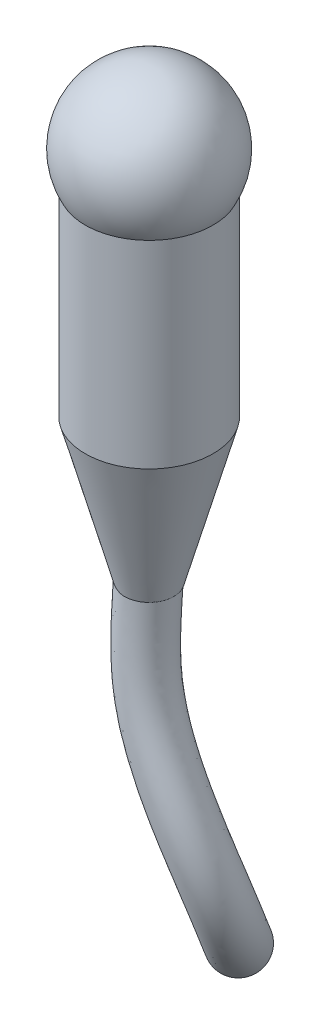
ISO-10303-21;
HEADER;
FILE_DESCRIPTION(('STEP AP214'),'2;1');
FILE_NAME('part.step','',(''),(''),'','','');
FILE_SCHEMA(('AUTOMOTIVE_DESIGN { 1 0 10303 214 1 1 1 1 }'));
ENDSEC;
DATA;
#1=APPLICATION_CONTEXT('core data for automotive mechanical design processes');
#2=APPLICATION_PROTOCOL_DEFINITION('international standard','automotive_design',2000,#1);
#3=PRODUCT_CONTEXT('',#1,'mechanical');
#4=PRODUCT('Part','Part','',(#3));
#5=PRODUCT_RELATED_PRODUCT_CATEGORY('part','',(#4));
#6=PRODUCT_DEFINITION_FORMATION('','',#4);
#7=PRODUCT_DEFINITION_CONTEXT('part definition',#1,'design');
#8=PRODUCT_DEFINITION('design','',#6,#7);
#9=PRODUCT_DEFINITION_SHAPE('','',#8);
#10=(LENGTH_UNIT() NAMED_UNIT(*) SI_UNIT(.MILLI.,.METRE.));
#11=(NAMED_UNIT(*) PLANE_ANGLE_UNIT() SI_UNIT($,.RADIAN.));
#12=(NAMED_UNIT(*) SI_UNIT($,.STERADIAN.) SOLID_ANGLE_UNIT());
#13=UNCERTAINTY_MEASURE_WITH_UNIT(LENGTH_MEASURE(1.E-05),#10,'distance_accuracy_value','');
#14=(GEOMETRIC_REPRESENTATION_CONTEXT(3) GLOBAL_UNCERTAINTY_ASSIGNED_CONTEXT((#13)) GLOBAL_UNIT_ASSIGNED_CONTEXT((#10,
#11,#12)) REPRESENTATION_CONTEXT('',''));
#15=CARTESIAN_POINT('',(0.,0.,0.));
#16=DIRECTION('',(0.,0.,1.));
#17=DIRECTION('',(1.,0.,0.));
#18=AXIS2_PLACEMENT_3D('',#15,#16,#17);
#19=CARTESIAN_POINT('',(0.,58.3812793036266,0.));
#20=DIRECTION('',(0.,-1.,0.));
#21=DIRECTION('',(-1.,0.,0.));
#22=AXIS2_PLACEMENT_3D('',#19,#20,#21);
#23=SPHERICAL_SURFACE('',#22,8.8);
#24=CARTESIAN_POINT('',(0.,54.2126464342076,0.));
#25=DIRECTION('',(0.,-1.,0.));
#26=DIRECTION('',(0.,0.,-1.));
#27=AXIS2_PLACEMENT_3D('',#24,#25,#26);
#28=CIRCLE('',#27,7.75);
#29=CARTESIAN_POINT('',(0.,54.2126464342076,-7.75));
#30=VERTEX_POINT('',#29);
#31=EDGE_CURVE('E76',#30,#30,#28,.T.);
#32=ORIENTED_EDGE('',*,*,#31,.F.);
#33=EDGE_LOOP('',(#32));
#34=FACE_BOUND('',#33,.T.);
#35=ADVANCED_FACE('F44',(#34),#23,.T.);
#36=CARTESIAN_POINT('',(-3.,12.850690899188,0.));
#37=DIRECTION('',(0.,1.,0.));
#38=DIRECTION('',(0.,0.,1.));
#39=AXIS2_PLACEMENT_3D('',#36,#37,#38);
#40=PLANE('',#39);
#41=CARTESIAN_POINT('',(0.,12.850690899188,0.));
#42=DIRECTION('',(0.,-1.,0.));
#43=DIRECTION('',(0.,0.,-1.));
#44=AXIS2_PLACEMENT_3D('',#41,#42,#43);
#45=CIRCLE('',#44,3.);
#46=CARTESIAN_POINT('',(0.134007092648553,12.850690899188,-2.99700552203694));
#47=VERTEX_POINT('',#46);
#48=CARTESIAN_POINT('',(-0.235301468746703,12.850690899188,2.99075796727279));
#49=VERTEX_POINT('',#48);
#50=EDGE_CURVE('E58',#47,#49,#45,.T.);
#51=ORIENTED_EDGE('',*,*,#50,.T.);
#52=CARTESIAN_POINT('',(-3.036,12.850690899188,0.757914247006341));
#53=CARTESIAN_POINT('',(-3.01453534718988,12.850690899188,0.839432556032653));
#54=CARTESIAN_POINT('',(-2.98961696251307,12.850690899188,0.92003717946122));
#55=CARTESIAN_POINT('',(-2.93308457112739,12.850690899188,1.07885900927999));
#56=CARTESIAN_POINT('',(-2.90147088579331,12.850690899188,1.15707633005475));
#57=CARTESIAN_POINT('',(-2.83178273683319,12.850690899188,1.31051616840775));
#58=CARTESIAN_POINT('',(-2.79371294244399,12.850690899188,1.38574080217837));
#59=CARTESIAN_POINT('',(-2.71139129984447,12.850690899188,1.53269982213694));
#60=CARTESIAN_POINT('',(-2.66713952762622,12.8506908991879,1.60443425121367));
#61=CARTESIAN_POINT('',(-2.52550302672171,12.8506908991879,1.81369800813955));
#62=CARTESIAN_POINT('',(-2.4192074994784,12.8506908991879,1.94535285670011));
#63=CARTESIAN_POINT('',(-2.18610207290923,12.850690899188,2.18885223563337));
#64=CARTESIAN_POINT('',(-2.05929614040584,12.850690899188,2.30070058794373));
#65=CARTESIAN_POINT('',(-1.7886702834515,12.850690899188,2.50158165055279));
#66=CARTESIAN_POINT('',(-1.64484629126984,12.850690899188,2.59060888988285));
#67=CARTESIAN_POINT('',(-1.3442850407071,12.8506908991879,2.74328538824266));
#68=CARTESIAN_POINT('',(-1.18754577584281,12.8506908991879,2.80693069499791));
#69=CARTESIAN_POINT('',(-0.865484441373721,12.8506908991879,2.90708326020741));
#70=CARTESIAN_POINT('',(-0.700155545991635,12.8506908991879,2.94356857180375));
#71=CARTESIAN_POINT('',(-0.365731527276455,12.850690899188,2.98829454598316));
#72=CARTESIAN_POINT('',(-0.196636619009383,12.850690899188,2.99653681730244));
#73=CARTESIAN_POINT('',(0.140725975646862,12.850690899188,2.98455510471622));
#74=CARTESIAN_POINT('',(0.308992562665089,12.850690899188,2.96430015911136));
#75=CARTESIAN_POINT('',(0.639747510129853,12.850690899188,2.89585109278276));
#76=CARTESIAN_POINT('',(0.802235720098235,12.850690899188,2.84765624502404));
#77=CARTESIAN_POINT('',(1.11695099781968,12.850690899188,2.72464810380082));
#78=CARTESIAN_POINT('',(1.2691699140783,12.850690899188,2.64981395372119));
#79=CARTESIAN_POINT('',(1.55888582954204,12.8506908991879,2.47565658731833));
#80=CARTESIAN_POINT('',(1.69638289035114,12.8506908991879,2.37633347347556));
#81=CARTESIAN_POINT('',(1.95276795616635,12.8506908991879,2.15599590803043));
#82=CARTESIAN_POINT('',(2.07165331317792,12.8506908991879,2.03497837508237));
#83=CARTESIAN_POINT('',(2.28740585196054,12.850690899188,1.77469146690402));
#84=CARTESIAN_POINT('',(2.38427304917174,12.850690899188,1.63542210447286));
#85=CARTESIAN_POINT('',(2.55317377824998,12.850690899188,1.34266891734483));
#86=CARTESIAN_POINT('',(2.62522172628744,12.850690899188,1.18919341018961));
#87=CARTESIAN_POINT('',(2.74249893369506,12.8506908991879,0.872316445531289));
#88=CARTESIAN_POINT('',(2.78772834425911,12.850690899188,0.708915043992769));
#89=CARTESIAN_POINT('',(2.85003472653281,12.850690899188,0.377003306307281));
#90=CARTESIAN_POINT('',(2.86714045642855,12.850690899188,0.20849836868621));
#91=CARTESIAN_POINT('',(2.87278950080723,12.8506908991879,-0.128989647688534));
#92=CARTESIAN_POINT('',(2.8613329803371,12.8506908991879,-0.297972723673649));
#93=CARTESIAN_POINT('',(2.81019978666376,12.8506908991879,-0.631442879368711));
#94=CARTESIAN_POINT('',(2.77055096867521,12.8506908991879,-0.795934230647587));
#95=CARTESIAN_POINT('',(2.66418576995046,12.850690899188,-1.11591932010876));
#96=CARTESIAN_POINT('',(2.59746948019102,12.850690899188,-1.27141308853092));
#97=CARTESIAN_POINT('',(2.43890647381336,12.8506908991879,-1.56890805264043));
#98=CARTESIAN_POINT('',(2.3470726096946,12.8506908991879,-1.71091609895345));
#99=CARTESIAN_POINT('',(2.14087093927895,12.850690899188,-1.97750155192417));
#100=CARTESIAN_POINT('',(2.02650317083045,12.850690899188,-2.10207898785809));
#101=CARTESIAN_POINT('',(1.77846488204402,12.850690899188,-2.33029437079982));
#102=CARTESIAN_POINT('',(1.64479120996408,12.850690899188,-2.43392889217846));
#103=CARTESIAN_POINT('',(1.36195232957652,12.850690899188,-2.6173051155245));
#104=CARTESIAN_POINT('',(1.21278697086643,12.850690899188,-2.69704658549483));
#105=CARTESIAN_POINT('',(0.903081269744321,12.850690899188,-2.83043940823771));
#106=CARTESIAN_POINT('',(0.742532455423861,12.850690899188,-2.88407109080216));
#107=CARTESIAN_POINT('',(0.414718090569481,12.8506908991879,-2.96364760463196));
#108=CARTESIAN_POINT('',(0.247452658693228,12.8506908991879,-2.98959292478934));
#109=CARTESIAN_POINT('',(-0.0892228520942838,12.8506908991879,-3.01308829888523));
#110=CARTESIAN_POINT('',(-0.258634843567239,12.8506908991879,-3.01061094691752));
#111=CARTESIAN_POINT('',(-0.594655617387066,12.850690899188,-2.97727357618437));
#112=CARTESIAN_POINT('',(-0.761264180402845,12.850690899188,-2.94641134709587));
#113=CARTESIAN_POINT('',(-1.08708833802037,12.850690899188,-2.85714419190242));
#114=CARTESIAN_POINT('',(-1.24629730941014,12.850690899188,-2.79871509368898));
#115=CARTESIAN_POINT('',(-1.55262288851786,12.8506908991879,-2.65597195859868));
#116=CARTESIAN_POINT('',(-1.69974180461163,12.850690899188,-2.57166287765793));
#117=CARTESIAN_POINT('',(-1.97776576162378,12.850690899188,-2.37954695908453));
#118=CARTESIAN_POINT('',(-2.10866700892144,12.850690899188,-2.27173463981282));
#119=CARTESIAN_POINT('',(-2.35059038358897,12.850690899188,-2.03554501829538));
#120=CARTESIAN_POINT('',(-2.46160553316535,12.850690899188,-1.90716052734089));
#121=CARTESIAN_POINT('',(-2.61554847362196,12.850690899188,-1.69543944854089));
#122=CARTESIAN_POINT('',(-2.66661097089121,12.850690899188,-1.61788234172115));
#123=CARTESIAN_POINT('',(-2.7613630046263,12.850690899188,-1.45834771841428));
#124=CARTESIAN_POINT('',(-2.80505168850483,12.850690899188,-1.37636969220823));
#125=CARTESIAN_POINT('',(-2.8847140360585,12.850690899188,-1.20857783182771));
#126=CARTESIAN_POINT('',(-2.92067408188656,12.850690899188,-1.1227575438214));
#127=CARTESIAN_POINT('',(-2.98448893212176,12.850690899188,-0.948156325264998));
#128=CARTESIAN_POINT('',(-3.01234385014103,12.850690899188,-0.859375436234033));
#129=CARTESIAN_POINT('',(-3.036,12.850690899188,-0.769483811605983));
#130=B_SPLINE_CURVE_WITH_KNOTS('',3,(#52,#53,#54,#55,#56,#57,#58,#59,#60,#61,#62,#63,#64,#65,
#66,#67,#68,#69,#70,#71,#72,#73,#74,#75,#76,#77,#78,#79,#80,#81,#82,#83,#84,#85,#86,#87,#88,#89,
#90,#91,#92,#93,#94,#95,#96,#97,#98,#99,#100,#101,#102,#103,#104,#105,#106,#107,#108,#109,#110,
#111,#112,#113,#114,#115,#116,#117,#118,#119,#120,#121,#122,#123,#124,#125,#126,#127,#128,#129),
.UNSPECIFIED.,.F.,.F.,(4,2,2,2,2,2,2,2,2,2,2,2,2,2,2,2,2,2,2,2,2,2,2,2,2,2,2,2,2,2,2,2,2,2,2,2,
2,2,4),(0.,0.25280848319997,0.505604834328379,0.758219129813679,1.01083032030711,
1.5158409785478,2.02075408154983,2.5257881158042,3.03090075930202,3.53642112148992,
4.04191268853312,4.54795388713157,5.05400825421426,5.56045969922222,6.0669090248878,
6.57343034066547,7.07995130124556,7.58617755291974,8.09240095063366,8.59810638123382,
9.10380888962262,9.60901243502334,10.114214282393,10.6191581033328,11.1241010761658,
11.629126575707,12.1341569787929,12.6395672677487,13.144968631908,13.6508573586025,
14.1567854820573,14.6631580572481,15.1694337240967,15.6758275957296,16.1823988083211,
16.4606313829957,16.7388961059341,17.0176471825854,17.2963943517063),.UNSPECIFIED.);
#131=EDGE_CURVE('E64',#49,#47,#130,.T.);
#132=ORIENTED_EDGE('',*,*,#131,.T.);
#133=EDGE_LOOP('',(#51,#132));
#134=FACE_BOUND('',#133,.T.);
#135=ADVANCED_FACE('F84',(#134),#40,.F.);
#136=CARTESIAN_POINT('',(0.,30.2126464342076,0.));
#137=DIRECTION('',(0.,1.,0.));
#138=DIRECTION('',(0.,0.,1.));
#139=AXIS2_PLACEMENT_3D('',#136,#137,#138);
#140=CONICAL_SURFACE('',#139,7.75,0.26705179651545);
#141=ORIENTED_EDGE('',*,*,#50,.F.);
#142=CARTESIAN_POINT('',(0.134007092648553,12.850690899188,-2.99700552203694));
#143=CARTESIAN_POINT('',(0.0504732445235257,12.8650414260412,-3.00467808502679));
#144=CARTESIAN_POINT('',(-0.0334168859771233,12.8792075697684,-3.00878701410247));
#145=CARTESIAN_POINT('',(-0.201318186460793,12.9070859097784,-3.00986795061194));
#146=CARTESIAN_POINT('',(-0.285329356149125,12.9207981071645,-3.00683997539232));
#147=CARTESIAN_POINT('',(-0.452846962408835,12.9476778825016,-2.99364021789881));
#148=CARTESIAN_POINT('',(-0.536353593414968,12.9608456834209,-2.98347139161793));
#149=CARTESIAN_POINT('',(-0.702268422927768,12.9865673513041,-2.95606366777852));
#150=CARTESIAN_POINT('',(-0.784676648666372,12.9991212335091,-2.93882494583649));
#151=CARTESIAN_POINT('',(-1.02948454435506,13.0357844685673,-2.87659712183902));
#152=CARTESIAN_POINT('',(-1.18949994972385,13.0589006051102,-2.82109378442348));
#153=CARTESIAN_POINT('',(-1.49801311835965,13.102022576208,-2.68361084008733));
#154=CARTESIAN_POINT('',(-1.64651450770096,13.1220293919821,-2.60163961096439));
#155=CARTESIAN_POINT('',(-1.92678814250346,13.1585692918199,-2.41415680841438));
#156=CARTESIAN_POINT('',(-2.05867163215412,13.1751260206303,-2.30881642456509));
#157=CARTESIAN_POINT('',(-2.30306967697562,13.2047808516614,-2.07721805331418));
#158=CARTESIAN_POINT('',(-2.41558131257698,13.2178784327058,-1.950956918523));
#159=CARTESIAN_POINT('',(-2.6174524331312,13.2404719528858,-1.68175822351326));
#160=CARTESIAN_POINT('',(-2.70691728438974,13.2499843787423,-1.538901053097));
#161=CARTESIAN_POINT('',(-2.86078406833737,13.2654608281464,-1.24011090482582));
#162=CARTESIAN_POINT('',(-2.92518804886262,13.2714251416471,-1.08417899663255));
#163=CARTESIAN_POINT('',(-3.02702025561417,13.2798114703823,-0.763896865499365));
#164=CARTESIAN_POINT('',(-3.06448644251455,13.2822384753603,-0.599558839881379));
#165=CARTESIAN_POINT('',(-3.11153430590277,13.2836116752968,-0.266921250596871));
#166=CARTESIAN_POINT('',(-3.12111524657972,13.282557778406,-0.0986215825122033));
#167=CARTESIAN_POINT('',(-3.11213942947094,13.2770425747445,0.237301036946384));
#168=CARTESIAN_POINT('',(-3.09356049809369,13.2725785841777,0.404923350725608));
#169=CARTESIAN_POINT('',(-3.02879091310779,13.2603448767374,0.734617642292637));
#170=CARTESIAN_POINT('',(-2.98260030642824,13.2525751654823,0.896689629513343));
#171=CARTESIAN_POINT('',(-2.86382705722849,13.2338426843069,1.21108661986789));
#172=CARTESIAN_POINT('',(-2.79118384205635,13.2228725975458,1.36338830135575));
#173=CARTESIAN_POINT('',(-2.62163789246755,13.1979140351236,1.65355284759677));
#174=CARTESIAN_POINT('',(-2.5247351280477,13.1839255557293,1.7914156944923));
#175=CARTESIAN_POINT('',(-2.30911801860235,13.1530844354816,2.04927409435888));
#176=CARTESIAN_POINT('',(-2.19033384891586,13.1362226390205,2.16921015738519));
#177=CARTESIAN_POINT('',(-1.93455879323563,13.0999111489654,2.3873540111847));
#178=CARTESIAN_POINT('',(-1.79756453556012,13.0804609761209,2.48555776912646));
#179=CARTESIAN_POINT('',(-1.50870368647774,13.0391877353418,2.65787231264559));
#180=CARTESIAN_POINT('',(-1.35677480239401,13.0173546827051,2.73187608844136));
#181=CARTESIAN_POINT('',(-1.04294068568469,12.9717507574273,2.85311902463623));
#182=CARTESIAN_POINT('',(-0.881044999120187,12.9479817321944,2.90038336672194));
#183=CARTESIAN_POINT('',(-0.637195947856197,12.9116489997525,2.94972917458205));
#184=CARTESIAN_POINT('',(-0.557194762622323,12.8996467829354,2.96253655077227));
#185=CARTESIAN_POINT('',(-0.396608453069378,12.8753681683666,2.98157027143321));
#186=CARTESIAN_POINT('',(-0.316024689237605,12.863092321242,2.98780879443762));
#187=CARTESIAN_POINT('',(-0.235301468746705,12.8506908991879,2.99075796727279));
#188=B_SPLINE_CURVE_WITH_KNOTS('',3,(#142,#143,#144,#145,#146,#147,#148,#149,#150,#151,#152,
#153,#154,#155,#156,#157,#158,#159,#160,#161,#162,#163,#164,#165,#166,#167,#168,#169,#170,#171,
#172,#173,#174,#175,#176,#177,#178,#179,#180,#181,#182,#183,#184,#185,#186,#187),.UNSPECIFIED.,
.F.,.F.,(4,2,2,2,2,2,2,2,2,2,2,2,2,2,2,2,2,2,2,2,2,2,4),(0.,0.25523241543905,0.510464210523982,
0.765590413293623,1.02071027910159,1.53085217623545,2.04083275780601,2.54719410884305,
3.05363170790204,3.55771112827773,4.06174934940895,4.56507588147605,5.06841569475241,
5.57215205283718,6.07588755476854,6.58078386726606,7.08568080420112,7.59221771606664,
8.09884854655644,8.60769026950331,9.1160519929831,9.36153593965005,9.60656395787482),.UNSPECIFIED.);
#189=EDGE_CURVE('E12',#47,#49,#188,.T.);
#190=ORIENTED_EDGE('',*,*,#189,.T.);
#191=EDGE_LOOP('',(#141,#190));
#192=FACE_BOUND('',#191,.T.);
#193=CARTESIAN_POINT('',(0.,30.2126464342076,0.));
#194=DIRECTION('',(0.,-1.,0.));
#195=DIRECTION('',(0.,0.,-1.));
#196=AXIS2_PLACEMENT_3D('',#193,#194,#195);
#197=CIRCLE('',#196,7.75);
#198=CARTESIAN_POINT('',(0.,30.2126464342076,-7.75));
#199=VERTEX_POINT('',#198);
#200=EDGE_CURVE('E123',#199,#199,#197,.T.);
#201=ORIENTED_EDGE('',*,*,#200,.T.);
#202=EDGE_LOOP('',(#201));
#203=FACE_BOUND('',#202,.T.);
#204=ADVANCED_FACE('F102',(#192,#203),#140,.T.);
#205=CARTESIAN_POINT('',(0.,0.,0.));
#206=DIRECTION('',(0.,-1.,0.));
#207=DIRECTION('',(0.,0.,-1.));
#208=AXIS2_PLACEMENT_3D('',#205,#206,#207);
#209=CYLINDRICAL_SURFACE('',#208,7.75);
#210=ORIENTED_EDGE('',*,*,#200,.F.);
#211=EDGE_LOOP('',(#210));
#212=FACE_BOUND('',#211,.T.);
#213=ORIENTED_EDGE('',*,*,#31,.T.);
#214=EDGE_LOOP('',(#213));
#215=FACE_BOUND('',#214,.T.);
#216=ADVANCED_FACE('F92',(#212,#215),#209,.T.);
#217=CARTESIAN_POINT('',(4.75715060304388,-27.6266682423645,-3.75744441062145));
#218=CARTESIAN_POINT('',(5.69857095394223,-26.2294212982871,-2.62390904831083));
#219=CARTESIAN_POINT('',(6.4748833375661,-24.6600468204225,-1.55104711329615));
#220=CARTESIAN_POINT('',(7.13216349588797,-21.9353834345446,-0.094616901820176));
#221=CARTESIAN_POINT('',(7.25702648909662,-20.9950521641348,0.348345854613561));
#222=CARTESIAN_POINT('',(7.31060804803402,-19.0649192388516,1.14299003003289));
#223=CARTESIAN_POINT('',(7.23726862742879,-18.0710757835996,1.4951352458388));
#224=CARTESIAN_POINT('',(6.77210846285164,-15.1351265468329,2.39014467795099));
#225=CARTESIAN_POINT('',(6.15235133764831,-13.2471542875376,2.7786182373638));
#226=CARTESIAN_POINT('',(4.7082414448164,-9.57181006985666,3.3105061919895));
#227=CARTESIAN_POINT('',(3.88666169104428,-7.78927104903873,3.45272077274813));
#228=CARTESIAN_POINT('',(2.71860362154967,-5.12571326770846,3.55954199986895));
#229=CARTESIAN_POINT('',(2.33817088184822,-4.23723879724996,3.57703437826453));
#230=CARTESIAN_POINT('',(1.62673447508452,-2.45125968809336,3.58342439221357));
#231=CARTESIAN_POINT('',(1.29594131755953,-1.55396264802341,3.57235434516711));
#232=CARTESIAN_POINT('',(0.42173227790827,1.17053199695927,3.50758936910492));
#233=CARTESIAN_POINT('',(0.0281714785636681,3.03508551263123,3.42076146183023));
#234=CARTESIAN_POINT('',(-0.257272731566499,5.89920218114731,3.27466185763846));
#235=CARTESIAN_POINT('',(-0.308336950738746,6.85466640319435,3.22403306710174));
#236=CARTESIAN_POINT('',(-0.352693512725628,8.75871277246069,3.12997345627654));
#237=CARTESIAN_POINT('',(-0.345821937847818,9.70662678311943,3.08657931087595));
#238=CARTESIAN_POINT('',(-0.281505860467549,12.5219835938465,2.98346152141873));
#239=CARTESIAN_POINT('',(-0.179370528387895,14.3715827356505,2.95001969538521));
#240=CARTESIAN_POINT('',(-0.122694632016336,16.1956060940217,2.99660760218372));
#241=CARTESIAN_POINT('',(10.073389612224,-29.7868561081076,-5.50992584617746));
#242=CARTESIAN_POINT('',(11.1886194546886,-28.1316428071877,-4.16711180825549));
#243=CARTESIAN_POINT('',(12.1900432290749,-26.1543385091818,-2.80032094281166));
#244=CARTESIAN_POINT('',(13.0582482374382,-22.5553141035774,-0.876513480255267));
#245=CARTESIAN_POINT('',(13.2274235140649,-21.294307430918,-0.2814598207786));
#246=CARTESIAN_POINT('',(13.299640575033,-18.6928693857778,0.789563413573156));
#247=CARTESIAN_POINT('',(13.20047559778,-17.3799902231325,1.25341304062864));
#248=CARTESIAN_POINT('',(12.5961313994775,-13.5655507990939,2.41622589870155));
#249=CARTESIAN_POINT('',(11.8269900378235,-11.2861762067441,2.8708822774333));
#250=CARTESIAN_POINT('',(10.2121572724435,-7.17633222912489,3.46564965536121));
#251=CARTESIAN_POINT('',(9.35491761748914,-5.32364770473789,3.60580361134372));
#252=CARTESIAN_POINT('',(8.22749394053359,-2.75274967162241,3.70890833649457));
#253=CARTESIAN_POINT('',(7.87325900066223,-1.9239516646942,3.72449381319744));
#254=CARTESIAN_POINT('',(7.2367258738194,-0.326008555883008,3.73021080639304));
#255=CARTESIAN_POINT('',(6.94922222709841,0.459357778534386,3.71972162737315));
#256=CARTESIAN_POINT('',(6.24584381964452,2.65145192343532,3.66761239308607));
#257=CARTESIAN_POINT('',(5.95488615031727,4.03442563326537,3.60220872653013));
#258=CARTESIAN_POINT('',(5.72841468867685,6.30682469057944,3.48629256350199));
#259=CARTESIAN_POINT('',(5.6827241245698,7.12708529894655,3.44272578494121));
#260=CARTESIAN_POINT('',(5.64403710568839,8.7877619857715,3.36068844546309));
#261=CARTESIAN_POINT('',(5.6496113683896,9.6435660806261,3.32122826320101));
#262=CARTESIAN_POINT('',(5.70945992723256,12.2633622038633,3.22527297104368));
#263=CARTESIAN_POINT('',(5.80996633988445,14.0908033714477,3.18843591096098));
#264=CARTESIAN_POINT('',(5.86939044360126,16.0032733943648,3.23728285891685));
#265=CARTESIAN_POINT('',(10.073389612224,-26.0067720226263,-10.1694284276438));
#266=CARTESIAN_POINT('',(11.0469939811582,-24.5617578733489,-8.99714127719292));
#267=CARTESIAN_POINT('',(11.8931544322644,-22.8788779282272,-7.83793507883842));
#268=CARTESIAN_POINT('',(12.6237587544641,-19.8502595706807,-6.21902996923997));
#269=CARTESIAN_POINT('',(12.7649926200918,-18.7945803367581,-5.72111126357487));
#270=CARTESIAN_POINT('',(12.8254743685217,-16.6158811686756,-4.82413137140357));
#271=CARTESIAN_POINT('',(12.7425521276528,-15.5071738424188,-4.43193182829771));
#272=CARTESIAN_POINT('',(12.2284291172784,-12.2621865288397,-3.44271379554936));
#273=CARTESIAN_POINT('',(11.5639349605744,-10.275366536581,-3.04231367707529));
#274=CARTESIAN_POINT('',(10.121886616323,-6.6052702934867,-2.51118564109414));
#275=CARTESIAN_POINT('',(9.34492136914448,-4.92559849616876,-2.38281136533913));
#276=CARTESIAN_POINT('',(8.30689619162061,-2.55855946773617,-2.28788233615264));
#277=CARTESIAN_POINT('',(7.9796565419648,-1.79348834657005,-2.27346328127898));
#278=CARTESIAN_POINT('',(7.38892989210946,-0.310537776845387,-2.26815772294812));
#279=CARTESIAN_POINT('',(7.11981407434749,0.423977332548026,-2.27795626446989));
#280=CARTESIAN_POINT('',(6.46219126695905,2.47347169981122,-2.32667570195208));
#281=CARTESIAN_POINT('',(6.18269349179558,3.78379201376972,-2.38830988112162));
#282=CARTESIAN_POINT('',(5.96098207224563,6.00842734596844,-2.50178961142729));
#283=CARTESIAN_POINT('',(5.9147522791992,6.82706272908768,-2.54528237174563));
#284=CARTESIAN_POINT('',(5.87561816940242,8.50692450369742,-2.6282674577751));
#285=CARTESIAN_POINT('',(5.88095899667864,9.38487687625024,-2.66882286264671));
#286=CARTESIAN_POINT('',(5.9431335943661,12.1065052556115,-2.76850796942208));
#287=CARTESIAN_POINT('',(6.04977693845547,14.056712641969,-2.80936498779496));
#288=CARTESIAN_POINT('',(6.11477970763393,16.148723121888,-2.75593234545058));
#289=CARTESIAN_POINT('',(4.75715060304388,-23.8465841568833,-8.41694699208777));
#290=CARTESIAN_POINT('',(5.55694548041505,-22.6595363644484,-7.45393851725111));
#291=CARTESIAN_POINT('',(6.17799454075808,-21.3845862394679,-6.58866124932373));
#292=CARTESIAN_POINT('',(6.69767401291264,-19.2303289016479,-5.43713339080447));
#293=CARTESIAN_POINT('',(6.79459559512318,-18.4953250699757,-5.09130558818312));
#294=CARTESIAN_POINT('',(6.83644184152316,-16.9879310217485,-4.47070475494344));
#295=CARTESIAN_POINT('',(6.77934515730045,-16.1982594028859,-4.19020962308754));
#296=CARTESIAN_POINT('',(6.40440618065496,-13.8317622765788,-3.46879501629992));
#297=CARTESIAN_POINT('',(5.88929626039927,-12.2363446173745,-3.13457771714681));
#298=CARTESIAN_POINT('',(4.61797078869594,-9.00074813421847,-2.66632910446382));
#299=CARTESIAN_POINT('',(3.87666544270124,-7.39122184046798,-2.53589420393554));
#300=CARTESIAN_POINT('',(2.79800587263589,-4.93152306382303,-2.43724867277786));
#301=CARTESIAN_POINT('',(2.4445684231512,-4.10677547912661,-2.42092271621229));
#302=CARTESIAN_POINT('',(1.77893849337418,-2.43578890905493,-2.41494413712718));
#303=CARTESIAN_POINT('',(1.46653316480941,-1.58934309400977,-2.42532354667514));
#304=CARTESIAN_POINT('',(0.638079725221192,0.992551773335171,-2.48669872593485));
#305=CARTESIAN_POINT('',(0.255978820041984,2.78445189313558,-2.569757145824));
#306=CARTESIAN_POINT('',(-0.0247053479977109,5.60080483653632,-2.71342031728958));
#307=CARTESIAN_POINT('',(-0.0763087961089338,6.55464383333548,-2.7639750895851));
#308=CARTESIAN_POINT('',(-0.121112449012017,8.47787529038661,-2.85898244696166));
#309=CARTESIAN_POINT('',(-0.1144743095592,9.44793757874274,-2.90347181497302));
#310=CARTESIAN_POINT('',(-0.0478321933331803,12.3651266455964,-3.01031941904453));
#311=CARTESIAN_POINT('',(0.0604400701831264,14.3374920061569,-3.04778120336575));
#312=CARTESIAN_POINT('',(0.122694632016331,16.3410558215449,-2.99660760218371));
#313=CARTESIAN_POINT('',(-0.559088406136204,-21.6863962911402,-6.66446555653177));
#314=CARTESIAN_POINT('',(0.066896979671878,-20.7573148555478,-5.91073575730931));
#315=CARTESIAN_POINT('',(0.462834649251732,-19.8902945507086,-5.33938741980904));
#316=CARTESIAN_POINT('',(0.771589271361156,-18.6103982326152,-4.65523681236897));
#317=CARTESIAN_POINT('',(0.824198570154526,-18.1960698031934,-4.46149991279136));
#318=CARTESIAN_POINT('',(0.84740931452461,-17.3599808748215,-4.1172781384833));
#319=CARTESIAN_POINT('',(0.816138186948064,-16.889344963353,-3.94848741787738));
#320=CARTESIAN_POINT('',(0.58038324403152,-15.4013380243178,-3.49487623705049));
#321=CARTESIAN_POINT('',(0.214657560224104,-14.197322698168,-3.22684175721833));
#322=CARTESIAN_POINT('',(-0.885945038931164,-11.3962259749502,-2.8214725678335));
#323=CARTESIAN_POINT('',(-1.59159048374199,-9.8568451847672,-2.68897704253193));
#324=CARTESIAN_POINT('',(-2.71088444634883,-7.30448665990989,-2.58661500940308));
#325=CARTESIAN_POINT('',(-3.0905196956624,-6.42006261168317,-2.5683821511456));
#326=CARTESIAN_POINT('',(-3.8310529053611,-4.56104004126447,-2.56173055130625));
#327=CARTESIAN_POINT('',(-4.18674774472867,-3.60266352056757,-2.57269082888038));
#328=CARTESIAN_POINT('',(-5.18603181651667,-0.488368153140879,-2.64672174991762));
#329=CARTESIAN_POINT('',(-5.67073585171162,1.78511177250144,-2.75120441052637));
#330=CARTESIAN_POINT('',(-6.01039276824106,5.19318232710419,-2.92505102315186));
#331=CARTESIAN_POINT('',(-6.06736987141706,6.28222493758328,-2.98266780742457));
#332=CARTESIAN_POINT('',(-6.11784306742645,8.44882607707579,-3.08969743614822));
#333=CARTESIAN_POINT('',(-6.10990761579704,9.51099828123524,-3.13812076729933));
#334=CARTESIAN_POINT('',(-6.03879798103246,12.6237480355813,-3.25213086866699));
#335=CARTESIAN_POINT('',(-5.92889679808922,14.6182713703447,-3.28619741893654));
#336=CARTESIAN_POINT('',(-5.86939044360126,16.5333885212018,-3.23728285891685));
#337=CARTESIAN_POINT('',(-0.559088406136204,-25.4664803766215,-2.00496297506544));
#338=CARTESIAN_POINT('',(0.208522453195901,-24.3271997893866,-1.08070628836618));
#339=CARTESIAN_POINT('',(0.759723446057296,-23.1657551316632,-0.301773283780642));
#340=CARTESIAN_POINT('',(1.20607875433772,-21.3154527655118,0.687279676614915));
#341=CARTESIAN_POINT('',(1.28662946412836,-20.6957968973517,0.978151530005721));
#342=CARTESIAN_POINT('',(1.32157552103506,-19.4369690919253,1.49641664649262));
#343=CARTESIAN_POINT('',(1.27406165707762,-18.7621613440667,1.73685745104897));
#344=CARTESIAN_POINT('',(0.948085526225768,-16.704702294572,2.36406345720043));
#345=CARTESIAN_POINT('',(0.477712637473143,-15.2081323683311,2.68635419729431));
#346=CARTESIAN_POINT('',(-0.795674382810698,-11.9672879105884,3.15536272861779));
#347=CARTESIAN_POINT('',(-1.58159423540057,-10.2548943933396,3.29963793415255));
#348=CARTESIAN_POINT('',(-2.79028669743424,-7.49867686379451,3.41017566324333));
#349=CARTESIAN_POINT('',(-3.19691723696578,-6.55052592980571,3.42957494333163));
#350=CARTESIAN_POINT('',(-3.98325692365035,-4.5765108203037,3.43663797803411));
#351=CARTESIAN_POINT('',(-4.35733959197936,-3.56728307458121,3.42498706296107));
#352=CARTESIAN_POINT('',(-5.40237926382798,-0.310387929516783,3.34756634512377));
#353=CARTESIAN_POINT('',(-5.89854319318993,2.03574539199709,3.23931419713034));
#354=CARTESIAN_POINT('',(-6.24296015180985,5.49157967171518,3.06303115177494));
#355=CARTESIAN_POINT('',(-6.29939802604729,6.58224750744215,3.00534034926227));
#356=CARTESIAN_POINT('',(-6.34942413113965,8.72966355914987,2.89925846708998));
#357=CARTESIAN_POINT('',(-6.34125524408524,9.76968748561276,2.85193035855089));
#358=CARTESIAN_POINT('',(-6.27247164816766,12.7806049838297,2.74165007179378));
#359=CARTESIAN_POINT('',(-6.16870739666024,14.6523620998533,2.71160347980945));
#360=CARTESIAN_POINT('',(-6.11477970763393,16.3879387936786,2.75593234545059));
#361=CARTESIAN_POINT('',(4.75715060304388,-27.6266682423645,-3.75744441062145));
#362=CARTESIAN_POINT('',(5.69857095394223,-26.2294212982871,-2.62390904831083));
#363=CARTESIAN_POINT('',(6.4748833375661,-24.6600468204225,-1.55104711329615));
#364=CARTESIAN_POINT('',(7.13216349588797,-21.9353834345446,-0.094616901820176));
#365=CARTESIAN_POINT('',(7.25702648909662,-20.9950521641348,0.348345854613561));
#366=CARTESIAN_POINT('',(7.31060804803402,-19.0649192388516,1.14299003003289));
#367=CARTESIAN_POINT('',(7.23726862742879,-18.0710757835996,1.4951352458388));
#368=CARTESIAN_POINT('',(6.77210846285164,-15.1351265468329,2.39014467795099));
#369=CARTESIAN_POINT('',(6.15235133764831,-13.2471542875376,2.7786182373638));
#370=CARTESIAN_POINT('',(4.7082414448164,-9.57181006985666,3.3105061919895));
#371=CARTESIAN_POINT('',(3.88666169104428,-7.78927104903873,3.45272077274813));
#372=CARTESIAN_POINT('',(2.71860362154967,-5.12571326770846,3.55954199986895));
#373=CARTESIAN_POINT('',(2.33817088184822,-4.23723879724996,3.57703437826453));
#374=CARTESIAN_POINT('',(1.62673447508452,-2.45125968809336,3.58342439221357));
#375=CARTESIAN_POINT('',(1.29594131755953,-1.55396264802341,3.57235434516711));
#376=CARTESIAN_POINT('',(0.42173227790827,1.17053199695927,3.50758936910492));
#377=CARTESIAN_POINT('',(0.0281714785636681,3.03508551263123,3.42076146183023));
#378=CARTESIAN_POINT('',(-0.257272731566499,5.89920218114731,3.27466185763846));
#379=CARTESIAN_POINT('',(-0.308336950738746,6.85466640319435,3.22403306710174));
#380=CARTESIAN_POINT('',(-0.352693512725628,8.75871277246069,3.12997345627654));
#381=CARTESIAN_POINT('',(-0.345821937847818,9.70662678311943,3.08657931087595));
#382=CARTESIAN_POINT('',(-0.281505860467549,12.5219835938465,2.98346152141873));
#383=CARTESIAN_POINT('',(-0.179370528387895,14.3715827356505,2.95001969538521));
#384=CARTESIAN_POINT('',(-0.122694632016336,16.1956060940217,2.99660760218372));
#385=(BOUNDED_SURFACE() B_SPLINE_SURFACE(3,3,((#217,#218,#219,#220,#221,#222,#223,#224,#225,
#226,#227,#228,#229,#230,#231,#232,#233,#234,#235,#236,#237,#238,#239,#240),(#241,#242,#243,
#244,#245,#246,#247,#248,#249,#250,#251,#252,#253,#254,#255,#256,#257,#258,#259,#260,#261,#262,
#263,#264),(#265,#266,#267,#268,#269,#270,#271,#272,#273,#274,#275,#276,#277,#278,#279,#280,
#281,#282,#283,#284,#285,#286,#287,#288),(#289,#290,#291,#292,#293,#294,#295,#296,#297,#298,
#299,#300,#301,#302,#303,#304,#305,#306,#307,#308,#309,#310,#311,#312),(#313,#314,#315,#316,
#317,#318,#319,#320,#321,#322,#323,#324,#325,#326,#327,#328,#329,#330,#331,#332,#333,#334,#335,
#336),(#337,#338,#339,#340,#341,#342,#343,#344,#345,#346,#347,#348,#349,#350,#351,#352,#353,
#354,#355,#356,#357,#358,#359,#360),(#361,#362,#363,#364,#365,#366,#367,#368,#369,#370,#371,
#372,#373,#374,#375,#376,#377,#378,#379,#380,#381,#382,#383,#384)),.UNSPECIFIED.,.T.,.F.,
.F.) B_SPLINE_SURFACE_WITH_KNOTS((4,3,4),(4,2,2,2,2,2,2,2,2,2,2,4),(0.,0.5,1.),(0.,0.125,
0.18750000000007,0.25,0.375,0.5,0.5625,0.625,0.75,0.8125,0.875,1.),
.UNSPECIFIED.) GEOMETRIC_REPRESENTATION_ITEM() RATIONAL_B_SPLINE_SURFACE(((1.,1.,1.,1.,1.,1.,1.,
1.,1.,1.,1.,1.,1.,1.,1.,1.,1.,1.,1.,1.,1.,1.,1.,1.),(0.333333333333333,0.333333333333333,
0.333333333333333,0.333333333333333,0.333333333333333,0.333333333333333,0.333333333333333,
0.333333333333333,0.333333333333333,0.333333333333333,0.333333333333333,0.333333333333333,
0.333333333333333,0.333333333333333,0.333333333333333,0.333333333333333,0.333333333333333,
0.333333333333333,0.333333333333333,0.333333333333333,0.333333333333333,0.333333333333333,
0.333333333333333,0.333333333333333),(0.333333333333333,0.333333333333333,0.333333333333333,
0.333333333333333,0.333333333333333,0.333333333333333,0.333333333333333,0.333333333333333,
0.333333333333333,0.333333333333333,0.333333333333333,0.333333333333333,0.333333333333333,
0.333333333333333,0.333333333333333,0.333333333333333,0.333333333333333,0.333333333333333,
0.333333333333333,0.333333333333333,0.333333333333333,0.333333333333333,0.333333333333333,
0.333333333333333),(1.,1.,1.,1.,1.,1.,1.,1.,1.,1.,1.,1.,1.,1.,1.,1.,1.,1.,1.,1.,1.,1.,1.,1.),
(0.333333333333333,0.333333333333333,0.333333333333333,0.333333333333333,0.333333333333333,
0.333333333333333,0.333333333333333,0.333333333333333,0.333333333333333,0.333333333333333,
0.333333333333333,0.333333333333333,0.333333333333333,0.333333333333333,0.333333333333333,
0.333333333333333,0.333333333333333,0.333333333333333,0.333333333333333,0.333333333333333,
0.333333333333333,0.333333333333333,0.333333333333333,0.333333333333333),(0.333333333333333,
0.333333333333333,0.333333333333333,0.333333333333333,0.333333333333333,0.333333333333333,
0.333333333333333,0.333333333333333,0.333333333333333,0.333333333333333,0.333333333333333,
0.333333333333333,0.333333333333333,0.333333333333333,0.333333333333333,0.333333333333333,
0.333333333333333,0.333333333333333,0.333333333333333,0.333333333333333,0.333333333333333,
0.333333333333333,0.333333333333333,0.333333333333333),(1.,1.,1.,1.,1.,1.,1.,1.,1.,1.,1.,1.,1.,
1.,1.,1.,1.,1.,1.,1.,1.,1.,1.,1.))) REPRESENTATION_ITEM('') SURFACE());
#386=CARTESIAN_POINT('',(4.75715060304388,-25.7366261996239,-6.08719570135461));
#387=DIRECTION('',(0.463609114486905,0.68808414963796,0.558217513144897));
#388=DIRECTION('',(0.,-0.630014014246877,0.77658376357772));
#389=AXIS2_PLACEMENT_3D('',#386,#387,#388);
#390=CIRCLE('',#389,3.);
#391=CARTESIAN_POINT('',(4.75715060304388,-27.6266682423645,-3.75744441062145));
#392=VERTEX_POINT('',#391);
#393=EDGE_CURVE('E70',#392,#392,#390,.T.);
#394=ORIENTED_EDGE('',*,*,#393,.T.);
#395=EDGE_LOOP('',(#394));
#396=FACE_BOUND('',#395,.T.);
#397=ORIENTED_EDGE('',*,*,#131,.F.);
#398=ORIENTED_EDGE('',*,*,#189,.F.);
#399=EDGE_LOOP('',(#397,#398));
#400=FACE_BOUND('',#399,.T.);
#401=ADVANCED_FACE('F86',(#396,#400),#385,.T.);
#402=CARTESIAN_POINT('',(4.75715060304388,-25.7366261996239,-6.08719570135461));
#403=DIRECTION('',(0.463609114486905,0.68808414963796,0.558217513144897));
#404=DIRECTION('',(0.,-0.630014014246877,0.77658376357772));
#405=AXIS2_PLACEMENT_3D('',#402,#403,#404);
#406=PLANE('',#405);
#407=ORIENTED_EDGE('',*,*,#393,.F.);
#408=EDGE_LOOP('',(#407));
#409=FACE_BOUND('',#408,.T.);
#410=ADVANCED_FACE('F71',(#409),#406,.F.);
#411=CLOSED_SHELL('',(#35,#135,#204,#216,#401,#410));
#412=MANIFOLD_SOLID_BREP('B2',#411);
#413=ADVANCED_BREP_SHAPE_REPRESENTATION('',(#18,#412),#14);
#414=SHAPE_DEFINITION_REPRESENTATION(#9,#413);
ENDSEC;
END-ISO-10303-21;
